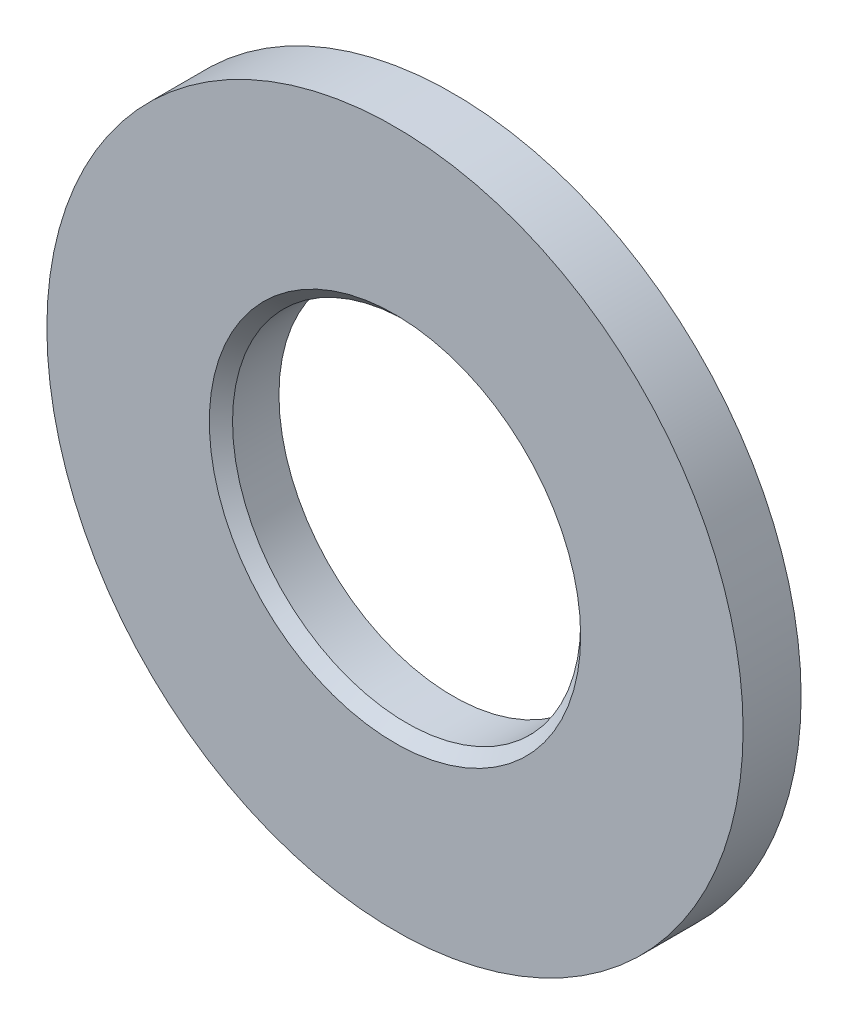
ISO-10303-21;
HEADER;
FILE_DESCRIPTION(('STEP AP214'),'2;1');
FILE_NAME('part.step','',(''),(''),'','','');
FILE_SCHEMA(('AUTOMOTIVE_DESIGN { 1 0 10303 214 1 1 1 1 }'));
ENDSEC;
DATA;
#1=APPLICATION_CONTEXT('core data for automotive mechanical design processes');
#2=APPLICATION_PROTOCOL_DEFINITION('international standard','automotive_design',2000,#1);
#3=PRODUCT_CONTEXT('',#1,'mechanical');
#4=PRODUCT('Part','Part','',(#3));
#5=PRODUCT_RELATED_PRODUCT_CATEGORY('part','',(#4));
#6=PRODUCT_DEFINITION_FORMATION('','',#4);
#7=PRODUCT_DEFINITION_CONTEXT('part definition',#1,'design');
#8=PRODUCT_DEFINITION('design','',#6,#7);
#9=PRODUCT_DEFINITION_SHAPE('','',#8);
#10=(LENGTH_UNIT() NAMED_UNIT(*) SI_UNIT(.MILLI.,.METRE.));
#11=(NAMED_UNIT(*) PLANE_ANGLE_UNIT() SI_UNIT($,.RADIAN.));
#12=(NAMED_UNIT(*) SI_UNIT($,.STERADIAN.) SOLID_ANGLE_UNIT());
#13=UNCERTAINTY_MEASURE_WITH_UNIT(LENGTH_MEASURE(1.E-05),#10,'distance_accuracy_value','');
#14=(GEOMETRIC_REPRESENTATION_CONTEXT(3) GLOBAL_UNCERTAINTY_ASSIGNED_CONTEXT((#13)) GLOBAL_UNIT_ASSIGNED_CONTEXT((#10,
#11,#12)) REPRESENTATION_CONTEXT('',''));
#15=CARTESIAN_POINT('',(0.,0.,0.));
#16=DIRECTION('',(0.,0.,1.));
#17=DIRECTION('',(1.,0.,0.));
#18=AXIS2_PLACEMENT_3D('',#15,#16,#17);
#19=CARTESIAN_POINT('',(0.,0.,1.));
#20=DIRECTION('',(0.,0.,1.));
#21=DIRECTION('',(1.,0.,0.));
#22=AXIS2_PLACEMENT_3D('',#19,#20,#21);
#23=PLANE('',#22);
#24=CARTESIAN_POINT('',(0.,0.,1.));
#25=DIRECTION('',(0.,0.,1.));
#26=DIRECTION('',(1.,0.,0.));
#27=AXIS2_PLACEMENT_3D('',#24,#25,#26);
#28=CIRCLE('',#27,3.2);
#29=CARTESIAN_POINT('',(3.2,0.,1.));
#30=VERTEX_POINT('',#29);
#31=EDGE_CURVE('E10',#30,#30,#28,.F.);
#32=ORIENTED_EDGE('',*,*,#31,.T.);
#33=EDGE_LOOP('',(#32));
#34=FACE_BOUND('',#33,.T.);
#35=CARTESIAN_POINT('',(0.,0.,1.));
#36=DIRECTION('',(0.,0.,1.));
#37=DIRECTION('',(1.,0.,0.));
#38=AXIS2_PLACEMENT_3D('',#35,#36,#37);
#39=CIRCLE('',#38,6.);
#40=CARTESIAN_POINT('',(6.,0.,1.));
#41=VERTEX_POINT('',#40);
#42=EDGE_CURVE('E59',#41,#41,#39,.T.);
#43=ORIENTED_EDGE('',*,*,#42,.T.);
#44=EDGE_LOOP('',(#43));
#45=FACE_BOUND('',#44,.T.);
#46=ADVANCED_FACE('F45',(#34,#45),#23,.T.);
#47=CARTESIAN_POINT('',(0.,0.,0.));
#48=DIRECTION('',(0.,0.,1.));
#49=DIRECTION('',(1.,0.,0.));
#50=AXIS2_PLACEMENT_3D('',#47,#48,#49);
#51=PLANE('',#50);
#52=CARTESIAN_POINT('',(0.,0.,0.));
#53=DIRECTION('',(0.,0.,1.));
#54=DIRECTION('',(1.,0.,0.));
#55=AXIS2_PLACEMENT_3D('',#52,#53,#54);
#56=CIRCLE('',#55,6.);
#57=CARTESIAN_POINT('',(6.,0.,0.));
#58=VERTEX_POINT('',#57);
#59=EDGE_CURVE('E64',#58,#58,#56,.T.);
#60=ORIENTED_EDGE('',*,*,#59,.F.);
#61=EDGE_LOOP('',(#60));
#62=FACE_BOUND('',#61,.T.);
#63=CARTESIAN_POINT('',(0.,0.,0.));
#64=DIRECTION('',(0.,0.,1.));
#65=DIRECTION('',(1.,0.,0.));
#66=AXIS2_PLACEMENT_3D('',#63,#64,#65);
#67=CIRCLE('',#66,3.);
#68=CARTESIAN_POINT('',(3.,0.,0.));
#69=VERTEX_POINT('',#68);
#70=EDGE_CURVE('E69',#69,#69,#67,.T.);
#71=ORIENTED_EDGE('',*,*,#70,.T.);
#72=EDGE_LOOP('',(#71));
#73=FACE_BOUND('',#72,.T.);
#74=ADVANCED_FACE('F75',(#62,#73),#51,.F.);
#75=CARTESIAN_POINT('',(0.,0.,1.));
#76=DIRECTION('',(0.,0.,-1.));
#77=DIRECTION('',(-1.,0.,0.));
#78=AXIS2_PLACEMENT_3D('',#75,#76,#77);
#79=CYLINDRICAL_SURFACE('',#78,6.);
#80=ORIENTED_EDGE('',*,*,#42,.F.);
#81=EDGE_LOOP('',(#80));
#82=FACE_BOUND('',#81,.T.);
#83=ORIENTED_EDGE('',*,*,#59,.T.);
#84=EDGE_LOOP('',(#83));
#85=FACE_BOUND('',#84,.T.);
#86=ADVANCED_FACE('F79',(#82,#85),#79,.T.);
#87=CARTESIAN_POINT('',(0.,0.,1.));
#88=DIRECTION('',(0.,0.,-1.));
#89=DIRECTION('',(-1.,0.,0.));
#90=AXIS2_PLACEMENT_3D('',#87,#88,#89);
#91=CYLINDRICAL_SURFACE('',#90,3.);
#92=CARTESIAN_POINT('',(0.,0.,0.799999999999999));
#93=DIRECTION('',(0.,0.,1.));
#94=DIRECTION('',(1.,0.,0.));
#95=AXIS2_PLACEMENT_3D('',#92,#93,#94);
#96=CIRCLE('',#95,3.);
#97=CARTESIAN_POINT('',(3.,0.,0.799999999999999));
#98=VERTEX_POINT('',#97);
#99=EDGE_CURVE('E54',#98,#98,#96,.T.);
#100=ORIENTED_EDGE('',*,*,#99,.T.);
#101=EDGE_LOOP('',(#100));
#102=FACE_BOUND('',#101,.T.);
#103=ORIENTED_EDGE('',*,*,#70,.F.);
#104=EDGE_LOOP('',(#103));
#105=FACE_BOUND('',#104,.T.);
#106=ADVANCED_FACE('F77',(#102,#105),#91,.F.);
#107=CARTESIAN_POINT('',(0.,0.,0.799999999999999));
#108=DIRECTION('',(0.,0.,1.));
#109=DIRECTION('',(1.,0.,0.));
#110=AXIS2_PLACEMENT_3D('',#107,#108,#109);
#111=CONICAL_SURFACE('',#110,3.,0.785398163397454);
#112=ORIENTED_EDGE('',*,*,#31,.F.);
#113=EDGE_LOOP('',(#112));
#114=FACE_BOUND('',#113,.T.);
#115=ORIENTED_EDGE('',*,*,#99,.F.);
#116=EDGE_LOOP('',(#115));
#117=FACE_BOUND('',#116,.T.);
#118=ADVANCED_FACE('F48',(#114,#117),#111,.F.);
#119=CLOSED_SHELL('',(#46,#74,#86,#106,#118));
#120=MANIFOLD_SOLID_BREP('B2',#119);
#121=ADVANCED_BREP_SHAPE_REPRESENTATION('',(#18,#120),#14);
#122=SHAPE_DEFINITION_REPRESENTATION(#9,#121);
ENDSEC;
END-ISO-10303-21;
